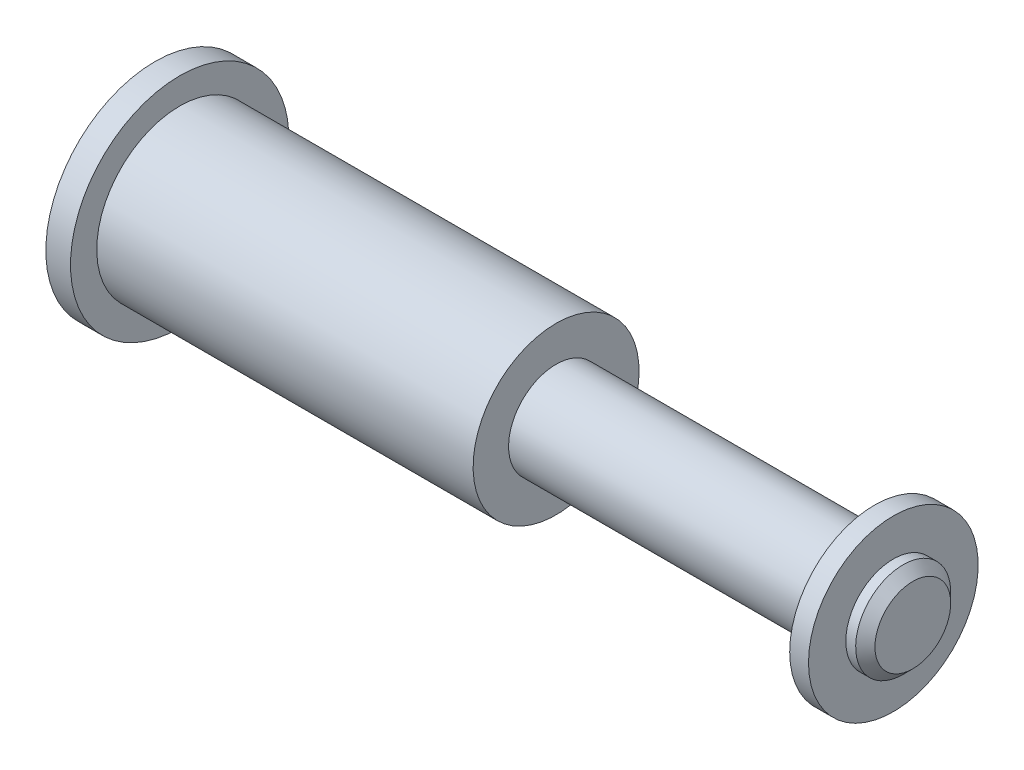
ISO-10303-21;
HEADER;
FILE_DESCRIPTION(('STEP AP214'),'2;1');
FILE_NAME('part.step','',(''),(''),'','','');
FILE_SCHEMA(('AUTOMOTIVE_DESIGN { 1 0 10303 214 1 1 1 1 }'));
ENDSEC;
DATA;
#1=APPLICATION_CONTEXT('core data for automotive mechanical design processes');
#2=APPLICATION_PROTOCOL_DEFINITION('international standard','automotive_design',2000,#1);
#3=PRODUCT_CONTEXT('',#1,'mechanical');
#4=PRODUCT('Part','Part','',(#3));
#5=PRODUCT_RELATED_PRODUCT_CATEGORY('part','',(#4));
#6=PRODUCT_DEFINITION_FORMATION('','',#4);
#7=PRODUCT_DEFINITION_CONTEXT('part definition',#1,'design');
#8=PRODUCT_DEFINITION('design','',#6,#7);
#9=PRODUCT_DEFINITION_SHAPE('','',#8);
#10=(LENGTH_UNIT() NAMED_UNIT(*) SI_UNIT(.MILLI.,.METRE.));
#11=(NAMED_UNIT(*) PLANE_ANGLE_UNIT() SI_UNIT($,.RADIAN.));
#12=(NAMED_UNIT(*) SI_UNIT($,.STERADIAN.) SOLID_ANGLE_UNIT());
#13=UNCERTAINTY_MEASURE_WITH_UNIT(LENGTH_MEASURE(1.E-05),#10,'distance_accuracy_value','');
#14=(GEOMETRIC_REPRESENTATION_CONTEXT(3) GLOBAL_UNCERTAINTY_ASSIGNED_CONTEXT((#13)) GLOBAL_UNIT_ASSIGNED_CONTEXT((#10,
#11,#12)) REPRESENTATION_CONTEXT('',''));
#15=CARTESIAN_POINT('',(0.,0.,0.));
#16=DIRECTION('',(0.,0.,1.));
#17=DIRECTION('',(1.,0.,0.));
#18=AXIS2_PLACEMENT_3D('',#15,#16,#17);
#19=CARTESIAN_POINT('',(35.7740247451099,0.,0.));
#20=DIRECTION('',(1.,0.,0.));
#21=DIRECTION('',(0.,0.,1.));
#22=AXIS2_PLACEMENT_3D('',#19,#20,#21);
#23=CYLINDRICAL_SURFACE('',#22,4.4958);
#24=CARTESIAN_POINT('',(0.,0.,0.));
#25=DIRECTION('',(-1.,0.,0.));
#26=DIRECTION('',(0.,1.,0.));
#27=AXIS2_PLACEMENT_3D('',#24,#25,#26);
#28=CIRCLE('',#27,4.4958);
#29=CARTESIAN_POINT('',(0.,4.4958,0.));
#30=VERTEX_POINT('',#29);
#31=EDGE_CURVE('E41',#30,#30,#28,.T.);
#32=ORIENTED_EDGE('',*,*,#31,.F.);
#33=EDGE_LOOP('',(#32));
#34=FACE_BOUND('',#33,.T.);
#35=CARTESIAN_POINT('',(1.016,0.,0.));
#36=DIRECTION('',(-1.,0.,0.));
#37=DIRECTION('',(0.,1.,0.));
#38=AXIS2_PLACEMENT_3D('',#35,#36,#37);
#39=CIRCLE('',#38,4.4958);
#40=CARTESIAN_POINT('',(1.016,4.4958,0.));
#41=VERTEX_POINT('',#40);
#42=EDGE_CURVE('E8',#41,#41,#39,.T.);
#43=ORIENTED_EDGE('',*,*,#42,.T.);
#44=EDGE_LOOP('',(#43));
#45=FACE_BOUND('',#44,.T.);
#46=ADVANCED_FACE('F13',(#34,#45),#23,.T.);
#47=CARTESIAN_POINT('',(30.799405,0.,0.));
#48=DIRECTION('',(-1.,0.,0.));
#49=DIRECTION('',(0.,-1.,0.));
#50=AXIS2_PLACEMENT_3D('',#47,#48,#49);
#51=CONICAL_SURFACE('',#50,1.9558,0.785398163397446);
#52=CARTESIAN_POINT('',(30.799405,0.,0.));
#53=DIRECTION('',(-1.,0.,0.));
#54=DIRECTION('',(0.,-1.,0.));
#55=AXIS2_PLACEMENT_3D('',#52,#53,#54);
#56=CIRCLE('',#55,1.9558);
#57=CARTESIAN_POINT('',(30.799405,-1.9558,0.));
#58=VERTEX_POINT('',#57);
#59=EDGE_CURVE('E42',#58,#58,#56,.T.);
#60=ORIENTED_EDGE('',*,*,#59,.F.);
#61=EDGE_LOOP('',(#60));
#62=FACE_BOUND('',#61,.T.);
#63=CARTESIAN_POINT('',(31.19628,0.,0.));
#64=DIRECTION('',(1.,0.,0.));
#65=DIRECTION('',(0.,0.,1.));
#66=AXIS2_PLACEMENT_3D('',#63,#64,#65);
#67=CIRCLE('',#66,1.558925);
#68=CARTESIAN_POINT('',(31.19628,0.,1.558925));
#69=VERTEX_POINT('',#68);
#70=EDGE_CURVE('E38',#69,#69,#67,.T.);
#71=ORIENTED_EDGE('',*,*,#70,.F.);
#72=EDGE_LOOP('',(#71));
#73=FACE_BOUND('',#72,.T.);
#74=ADVANCED_FACE('F84',(#62,#73),#51,.T.);
#75=CARTESIAN_POINT('',(1.016,0.,0.));
#76=DIRECTION('',(-1.,0.,0.));
#77=DIRECTION('',(0.,0.,1.));
#78=AXIS2_PLACEMENT_3D('',#75,#76,#77);
#79=PLANE('',#78);
#80=ORIENTED_EDGE('',*,*,#42,.F.);
#81=EDGE_LOOP('',(#80));
#82=FACE_BOUND('',#81,.T.);
#83=CARTESIAN_POINT('',(1.016,0.,0.));
#84=DIRECTION('',(-1.,0.,0.));
#85=DIRECTION('',(0.,1.,0.));
#86=AXIS2_PLACEMENT_3D('',#83,#84,#85);
#87=CIRCLE('',#86,3.4163);
#88=CARTESIAN_POINT('',(1.016,3.4163,0.));
#89=VERTEX_POINT('',#88);
#90=EDGE_CURVE('E22',#89,#89,#87,.T.);
#91=ORIENTED_EDGE('',*,*,#90,.T.);
#92=EDGE_LOOP('',(#91));
#93=FACE_BOUND('',#92,.T.);
#94=ADVANCED_FACE('F87',(#82,#93),#79,.F.);
#95=CARTESIAN_POINT('',(15.2781,0.,0.));
#96=DIRECTION('',(1.,0.,0.));
#97=DIRECTION('',(0.,0.,1.));
#98=AXIS2_PLACEMENT_3D('',#95,#96,#97);
#99=CYLINDRICAL_SURFACE('',#98,3.4163);
#100=ORIENTED_EDGE('',*,*,#90,.F.);
#101=EDGE_LOOP('',(#100));
#102=FACE_BOUND('',#101,.T.);
#103=CARTESIAN_POINT('',(16.51,0.,0.));
#104=DIRECTION('',(-1.,0.,0.));
#105=DIRECTION('',(0.,1.,0.));
#106=AXIS2_PLACEMENT_3D('',#103,#104,#105);
#107=CIRCLE('',#106,3.4163);
#108=CARTESIAN_POINT('',(16.51,3.4163,0.));
#109=VERTEX_POINT('',#108);
#110=EDGE_CURVE('E32',#109,#109,#107,.T.);
#111=ORIENTED_EDGE('',*,*,#110,.T.);
#112=EDGE_LOOP('',(#111));
#113=FACE_BOUND('',#112,.T.);
#114=ADVANCED_FACE('F111',(#102,#113),#99,.T.);
#115=CARTESIAN_POINT('',(16.51,0.,0.));
#116=DIRECTION('',(-1.,0.,0.));
#117=DIRECTION('',(0.,0.,1.));
#118=AXIS2_PLACEMENT_3D('',#115,#116,#117);
#119=PLANE('',#118);
#120=ORIENTED_EDGE('',*,*,#110,.F.);
#121=EDGE_LOOP('',(#120));
#122=FACE_BOUND('',#121,.T.);
#123=CARTESIAN_POINT('',(16.51,0.,0.));
#124=DIRECTION('',(-1.,0.,0.));
#125=DIRECTION('',(0.,-1.,0.));
#126=AXIS2_PLACEMENT_3D('',#123,#124,#125);
#127=CIRCLE('',#126,1.9558);
#128=CARTESIAN_POINT('',(16.51,-1.9558,0.));
#129=VERTEX_POINT('',#128);
#130=EDGE_CURVE('E51',#129,#129,#127,.T.);
#131=ORIENTED_EDGE('',*,*,#130,.T.);
#132=EDGE_LOOP('',(#131));
#133=FACE_BOUND('',#132,.T.);
#134=ADVANCED_FACE('F109',(#122,#133),#119,.F.);
#135=CARTESIAN_POINT('',(1.016,0.,0.));
#136=DIRECTION('',(-1.,0.,0.));
#137=DIRECTION('',(0.,0.,-1.));
#138=AXIS2_PLACEMENT_3D('',#135,#136,#137);
#139=CYLINDRICAL_SURFACE('',#138,1.9558);
#140=ORIENTED_EDGE('',*,*,#130,.F.);
#141=EDGE_LOOP('',(#140));
#142=FACE_BOUND('',#141,.T.);
#143=CARTESIAN_POINT('',(29.619575,0.,0.));
#144=DIRECTION('',(-1.,0.,0.));
#145=DIRECTION('',(0.,1.,0.));
#146=AXIS2_PLACEMENT_3D('',#143,#144,#145);
#147=CIRCLE('',#146,1.9558);
#148=CARTESIAN_POINT('',(29.619575,1.9558,0.));
#149=VERTEX_POINT('',#148);
#150=EDGE_CURVE('E17',#149,#149,#147,.T.);
#151=ORIENTED_EDGE('',*,*,#150,.T.);
#152=EDGE_LOOP('',(#151));
#153=FACE_BOUND('',#152,.T.);
#154=ADVANCED_FACE('F98',(#142,#153),#139,.T.);
#155=CARTESIAN_POINT('',(0.,0.,0.));
#156=DIRECTION('',(-1.,0.,0.));
#157=DIRECTION('',(0.,0.,1.));
#158=AXIS2_PLACEMENT_3D('',#155,#156,#157);
#159=PLANE('',#158);
#160=ORIENTED_EDGE('',*,*,#31,.T.);
#161=EDGE_LOOP('',(#160));
#162=FACE_BOUND('',#161,.T.);
#163=ADVANCED_FACE('F92',(#162),#159,.T.);
#164=CARTESIAN_POINT('',(31.19628,0.,0.));
#165=DIRECTION('',(-1.,0.,0.));
#166=DIRECTION('',(0.,0.,1.));
#167=AXIS2_PLACEMENT_3D('',#164,#165,#166);
#168=PLANE('',#167);
#169=ORIENTED_EDGE('',*,*,#70,.T.);
#170=EDGE_LOOP('',(#169));
#171=FACE_BOUND('',#170,.T.);
#172=ADVANCED_FACE('F81',(#171),#168,.F.);
#173=CARTESIAN_POINT('',(32.385,0.,0.));
#174=DIRECTION('',(1.,0.,0.));
#175=DIRECTION('',(0.,-1.,0.));
#176=AXIS2_PLACEMENT_3D('',#173,#174,#175);
#177=CYLINDRICAL_SURFACE('',#176,1.9558);
#178=CARTESIAN_POINT('',(30.39348125,0.,0.));
#179=DIRECTION('',(-1.,0.,0.));
#180=DIRECTION('',(0.,0.,1.));
#181=AXIS2_PLACEMENT_3D('',#178,#179,#180);
#182=CIRCLE('',#181,1.9558);
#183=CARTESIAN_POINT('',(30.39348125,0.,1.9558));
#184=VERTEX_POINT('',#183);
#185=EDGE_CURVE('E36',#184,#184,#182,.T.);
#186=ORIENTED_EDGE('',*,*,#185,.F.);
#187=EDGE_LOOP('',(#186));
#188=FACE_BOUND('',#187,.T.);
#189=ORIENTED_EDGE('',*,*,#59,.T.);
#190=EDGE_LOOP('',(#189));
#191=FACE_BOUND('',#190,.T.);
#192=ADVANCED_FACE('F15',(#188,#191),#177,.T.);
#193=CARTESIAN_POINT('',(29.619575,0.,0.));
#194=DIRECTION('',(-1.,0.,0.));
#195=DIRECTION('',(0.,0.,1.));
#196=AXIS2_PLACEMENT_3D('',#193,#194,#195);
#197=PLANE('',#196);
#198=CARTESIAN_POINT('',(29.619575,0.,0.));
#199=DIRECTION('',(-1.,0.,0.));
#200=DIRECTION('',(0.,0.,1.));
#201=AXIS2_PLACEMENT_3D('',#198,#199,#200);
#202=CIRCLE('',#201,3.4925);
#203=CARTESIAN_POINT('',(29.619575,0.,3.4925));
#204=VERTEX_POINT('',#203);
#205=EDGE_CURVE('E66',#204,#204,#202,.T.);
#206=ORIENTED_EDGE('',*,*,#205,.T.);
#207=EDGE_LOOP('',(#206));
#208=FACE_BOUND('',#207,.T.);
#209=ORIENTED_EDGE('',*,*,#150,.F.);
#210=EDGE_LOOP('',(#209));
#211=FACE_BOUND('',#210,.T.);
#212=ADVANCED_FACE('F80',(#208,#211),#197,.T.);
#213=CARTESIAN_POINT('',(30.39348125,0.,0.));
#214=DIRECTION('',(-1.,0.,0.));
#215=DIRECTION('',(0.,0.,1.));
#216=AXIS2_PLACEMENT_3D('',#213,#214,#215);
#217=PLANE('',#216);
#218=CARTESIAN_POINT('',(30.39348125,0.,0.));
#219=DIRECTION('',(-1.,0.,0.));
#220=DIRECTION('',(0.,0.,1.));
#221=AXIS2_PLACEMENT_3D('',#218,#219,#220);
#222=CIRCLE('',#221,3.4925);
#223=CARTESIAN_POINT('',(30.39348125,0.,3.4925));
#224=VERTEX_POINT('',#223);
#225=EDGE_CURVE('E46',#224,#224,#222,.T.);
#226=ORIENTED_EDGE('',*,*,#225,.F.);
#227=EDGE_LOOP('',(#226));
#228=FACE_BOUND('',#227,.T.);
#229=ORIENTED_EDGE('',*,*,#185,.T.);
#230=EDGE_LOOP('',(#229));
#231=FACE_BOUND('',#230,.T.);
#232=ADVANCED_FACE('F76',(#228,#231),#217,.F.);
#233=CARTESIAN_POINT('',(29.45685625,0.,0.));
#234=DIRECTION('',(-1.,0.,0.));
#235=DIRECTION('',(0.,0.,-1.));
#236=AXIS2_PLACEMENT_3D('',#233,#234,#235);
#237=CYLINDRICAL_SURFACE('',#236,3.4925);
#238=ORIENTED_EDGE('',*,*,#225,.T.);
#239=EDGE_LOOP('',(#238));
#240=FACE_BOUND('',#239,.T.);
#241=ORIENTED_EDGE('',*,*,#205,.F.);
#242=EDGE_LOOP('',(#241));
#243=FACE_BOUND('',#242,.T.);
#244=ADVANCED_FACE('F120',(#240,#243),#237,.T.);
#245=CLOSED_SHELL('',(#46,#74,#94,#114,#134,#154,#163,#172,#192,#212,#232,#244));
#246=MANIFOLD_SOLID_BREP('B1',#245);
#247=ADVANCED_BREP_SHAPE_REPRESENTATION('',(#18,#246),#14);
#248=SHAPE_DEFINITION_REPRESENTATION(#9,#247);
ENDSEC;
END-ISO-10303-21;
